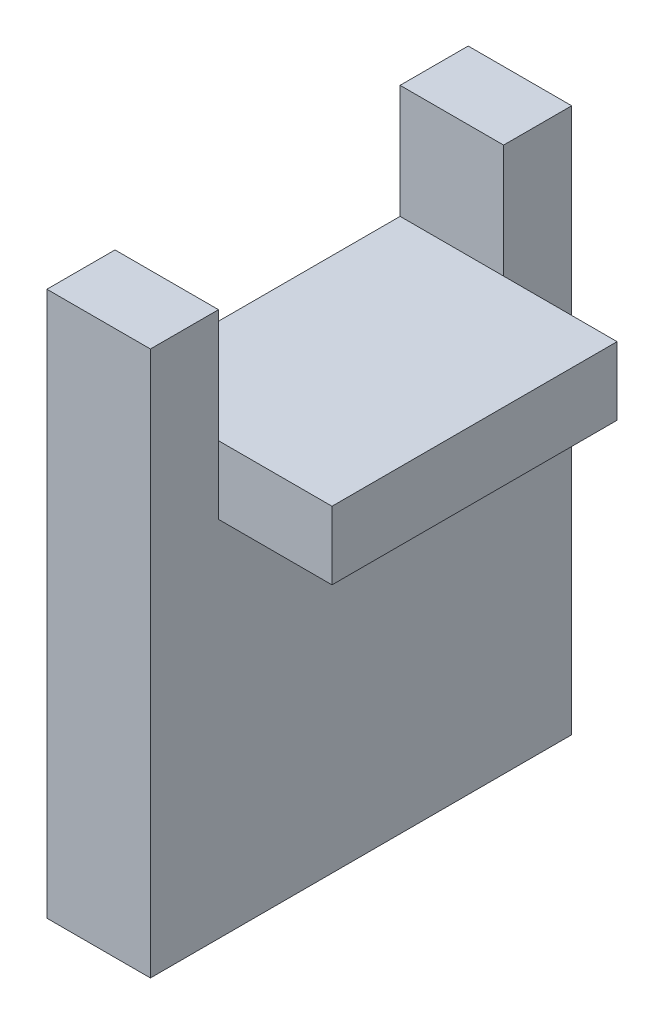
ISO-10303-21;
HEADER;
FILE_DESCRIPTION(('STEP AP214'),'2;1');
FILE_NAME('part.step','',(''),(''),'','','');
FILE_SCHEMA(('AUTOMOTIVE_DESIGN { 1 0 10303 214 1 1 1 1 }'));
ENDSEC;
DATA;
#1=APPLICATION_CONTEXT('core data for automotive mechanical design processes');
#2=APPLICATION_PROTOCOL_DEFINITION('international standard','automotive_design',2000,#1);
#3=PRODUCT_CONTEXT('',#1,'mechanical');
#4=PRODUCT('Part','Part','',(#3));
#5=PRODUCT_RELATED_PRODUCT_CATEGORY('part','',(#4));
#6=PRODUCT_DEFINITION_FORMATION('','',#4);
#7=PRODUCT_DEFINITION_CONTEXT('part definition',#1,'design');
#8=PRODUCT_DEFINITION('design','',#6,#7);
#9=PRODUCT_DEFINITION_SHAPE('','',#8);
#10=(LENGTH_UNIT() NAMED_UNIT(*) SI_UNIT(.MILLI.,.METRE.));
#11=(NAMED_UNIT(*) PLANE_ANGLE_UNIT() SI_UNIT($,.RADIAN.));
#12=(NAMED_UNIT(*) SI_UNIT($,.STERADIAN.) SOLID_ANGLE_UNIT());
#13=UNCERTAINTY_MEASURE_WITH_UNIT(LENGTH_MEASURE(1.E-05),#10,'distance_accuracy_value','');
#14=(GEOMETRIC_REPRESENTATION_CONTEXT(3) GLOBAL_UNCERTAINTY_ASSIGNED_CONTEXT((#13)) GLOBAL_UNIT_ASSIGNED_CONTEXT((#10,
#11,#12)) REPRESENTATION_CONTEXT('',''));
#15=CARTESIAN_POINT('',(0.,0.,0.));
#16=DIRECTION('',(0.,0.,1.));
#17=DIRECTION('',(1.,0.,0.));
#18=AXIS2_PLACEMENT_3D('',#15,#16,#17);
#19=CARTESIAN_POINT('',(4.56,24.,0.));
#20=DIRECTION('',(-1.,0.,0.));
#21=DIRECTION('',(0.,0.,1.));
#22=AXIS2_PLACEMENT_3D('',#19,#20,#21);
#23=PLANE('',#22);
#24=DIRECTION('',(0.,-1.,0.));
#25=VECTOR('',#24,1.);
#26=CARTESIAN_POINT('',(4.56,19.,-3.));
#27=LINE('',#26,#25);
#28=CARTESIAN_POINT('',(4.56,19.,-3.));
#29=VERTEX_POINT('',#28);
#30=CARTESIAN_POINT('',(4.56,16.,-3.));
#31=VERTEX_POINT('',#30);
#32=EDGE_CURVE('E138',#29,#31,#27,.T.);
#33=ORIENTED_EDGE('',*,*,#32,.F.);
#34=DIRECTION('',(0.,1.,0.));
#35=VECTOR('',#34,1.);
#36=CARTESIAN_POINT('',(4.56,19.,-3.));
#37=LINE('',#36,#35);
#38=CARTESIAN_POINT('',(4.56,24.,-3.));
#39=VERTEX_POINT('',#38);
#40=EDGE_CURVE('E156',#29,#39,#37,.T.);
#41=ORIENTED_EDGE('',*,*,#40,.T.);
#42=DIRECTION('',(0.,0.,-1.));
#43=VECTOR('',#42,1.);
#44=CARTESIAN_POINT('',(4.56,24.,0.));
#45=LINE('',#44,#43);
#46=CARTESIAN_POINT('',(4.56,24.,0.));
#47=VERTEX_POINT('',#46);
#48=EDGE_CURVE('E173',#47,#39,#45,.T.);
#49=ORIENTED_EDGE('',*,*,#48,.F.);
#50=DIRECTION('',(0.,-1.,0.));
#51=VECTOR('',#50,1.);
#52=CARTESIAN_POINT('',(4.56,24.,0.));
#53=LINE('',#52,#51);
#54=CARTESIAN_POINT('',(4.56,0.,0.));
#55=VERTEX_POINT('',#54);
#56=EDGE_CURVE('E41',#47,#55,#53,.T.);
#57=ORIENTED_EDGE('',*,*,#56,.T.);
#58=DIRECTION('',(0.,0.,-1.));
#59=VECTOR('',#58,1.);
#60=CARTESIAN_POINT('',(4.56,0.,0.));
#61=LINE('',#60,#59);
#62=CARTESIAN_POINT('',(4.56,0.,-18.56));
#63=VERTEX_POINT('',#62);
#64=EDGE_CURVE('E183',#55,#63,#61,.T.);
#65=ORIENTED_EDGE('',*,*,#64,.T.);
#66=DIRECTION('',(0.,-1.,0.));
#67=VECTOR('',#66,1.);
#68=CARTESIAN_POINT('',(4.56,24.,-18.56));
#69=LINE('',#68,#67);
#70=CARTESIAN_POINT('',(4.56,24.,-18.56));
#71=VERTEX_POINT('',#70);
#72=EDGE_CURVE('E189',#71,#63,#69,.T.);
#73=ORIENTED_EDGE('',*,*,#72,.F.);
#74=CARTESIAN_POINT('',(4.56,24.,-15.56));
#75=VERTEX_POINT('',#74);
#76=EDGE_CURVE('E172',#75,#71,#45,.T.);
#77=ORIENTED_EDGE('',*,*,#76,.F.);
#78=DIRECTION('',(0.,1.,0.));
#79=VECTOR('',#78,1.);
#80=CARTESIAN_POINT('',(4.56,19.,-15.56));
#81=LINE('',#80,#79);
#82=CARTESIAN_POINT('',(4.56,19.,-15.56));
#83=VERTEX_POINT('',#82);
#84=EDGE_CURVE('E56',#83,#75,#81,.T.);
#85=ORIENTED_EDGE('',*,*,#84,.F.);
#86=DIRECTION('',(0.,1.,0.));
#87=VECTOR('',#86,1.);
#88=CARTESIAN_POINT('',(4.56,19.,-15.56));
#89=LINE('',#88,#87);
#90=CARTESIAN_POINT('',(4.56,16.,-15.56));
#91=VERTEX_POINT('',#90);
#92=EDGE_CURVE('E135',#91,#83,#89,.T.);
#93=ORIENTED_EDGE('',*,*,#92,.F.);
#94=DIRECTION('',(0.,0.,-1.));
#95=VECTOR('',#94,1.);
#96=CARTESIAN_POINT('',(4.56,16.,-3.));
#97=LINE('',#96,#95);
#98=EDGE_CURVE('E48',#31,#91,#97,.T.);
#99=ORIENTED_EDGE('',*,*,#98,.F.);
#100=EDGE_LOOP('',(#33,#41,#49,#57,#65,#73,#77,#85,#93,#99));
#101=FACE_BOUND('',#100,.T.);
#102=ADVANCED_FACE('F33',(#101),#23,.F.);
#103=CARTESIAN_POINT('',(0.,24.,0.));
#104=DIRECTION('',(0.,-1.,0.));
#105=DIRECTION('',(0.,0.,-1.));
#106=AXIS2_PLACEMENT_3D('',#103,#104,#105);
#107=PLANE('',#106);
#108=ORIENTED_EDGE('',*,*,#48,.T.);
#109=DIRECTION('',(1.,0.,0.));
#110=VECTOR('',#109,1.);
#111=CARTESIAN_POINT('',(4.56,24.,-3.));
#112=LINE('',#111,#110);
#113=CARTESIAN_POINT('',(0.,24.,-3.));
#114=VERTEX_POINT('',#113);
#115=EDGE_CURVE('E141',#114,#39,#112,.T.);
#116=ORIENTED_EDGE('',*,*,#115,.F.);
#117=DIRECTION('',(0.,0.,1.));
#118=VECTOR('',#117,1.);
#119=CARTESIAN_POINT('',(0.,24.,0.));
#120=LINE('',#119,#118);
#121=CARTESIAN_POINT('',(0.,24.,0.));
#122=VERTEX_POINT('',#121);
#123=EDGE_CURVE('E170',#114,#122,#120,.T.);
#124=ORIENTED_EDGE('',*,*,#123,.T.);
#125=DIRECTION('',(1.,0.,0.));
#126=VECTOR('',#125,1.);
#127=CARTESIAN_POINT('',(0.,24.,0.));
#128=LINE('',#127,#126);
#129=EDGE_CURVE('E169',#122,#47,#128,.T.);
#130=ORIENTED_EDGE('',*,*,#129,.T.);
#131=EDGE_LOOP('',(#108,#116,#124,#130));
#132=FACE_BOUND('',#131,.T.);
#133=ADVANCED_FACE('F235',(#132),#107,.F.);
#134=CARTESIAN_POINT('',(0.,24.,0.));
#135=DIRECTION('',(1.,0.,0.));
#136=DIRECTION('',(0.,0.,-1.));
#137=AXIS2_PLACEMENT_3D('',#134,#135,#136);
#138=PLANE('',#137);
#139=ORIENTED_EDGE('',*,*,#123,.F.);
#140=DIRECTION('',(0.,1.,0.));
#141=VECTOR('',#140,1.);
#142=CARTESIAN_POINT('',(0.,19.,-3.));
#143=LINE('',#142,#141);
#144=CARTESIAN_POINT('',(0.,19.,-3.));
#145=VERTEX_POINT('',#144);
#146=EDGE_CURVE('E160',#145,#114,#143,.T.);
#147=ORIENTED_EDGE('',*,*,#146,.F.);
#148=DIRECTION('',(0.,0.,1.));
#149=VECTOR('',#148,1.);
#150=CARTESIAN_POINT('',(0.,19.,-3.));
#151=LINE('',#150,#149);
#152=CARTESIAN_POINT('',(0.,19.,-15.56));
#153=VERTEX_POINT('',#152);
#154=EDGE_CURVE('E150',#153,#145,#151,.T.);
#155=ORIENTED_EDGE('',*,*,#154,.F.);
#156=DIRECTION('',(0.,1.,0.));
#157=VECTOR('',#156,1.);
#158=CARTESIAN_POINT('',(0.,19.,-15.56));
#159=LINE('',#158,#157);
#160=CARTESIAN_POINT('',(0.,24.,-15.56));
#161=VERTEX_POINT('',#160);
#162=EDGE_CURVE('E162',#153,#161,#159,.T.);
#163=ORIENTED_EDGE('',*,*,#162,.T.);
#164=CARTESIAN_POINT('',(0.,24.,-18.56));
#165=VERTEX_POINT('',#164);
#166=EDGE_CURVE('E166',#165,#161,#120,.T.);
#167=ORIENTED_EDGE('',*,*,#166,.F.);
#168=DIRECTION('',(0.,-1.,0.));
#169=VECTOR('',#168,1.);
#170=CARTESIAN_POINT('',(0.,24.,-18.56));
#171=LINE('',#170,#169);
#172=CARTESIAN_POINT('',(0.,0.,-18.56));
#173=VERTEX_POINT('',#172);
#174=EDGE_CURVE('E178',#165,#173,#171,.T.);
#175=ORIENTED_EDGE('',*,*,#174,.T.);
#176=DIRECTION('',(0.,0.,1.));
#177=VECTOR('',#176,1.);
#178=CARTESIAN_POINT('',(0.,0.,0.));
#179=LINE('',#178,#177);
#180=CARTESIAN_POINT('',(0.,0.,0.));
#181=VERTEX_POINT('',#180);
#182=EDGE_CURVE('E159',#173,#181,#179,.T.);
#183=ORIENTED_EDGE('',*,*,#182,.T.);
#184=DIRECTION('',(0.,-1.,0.));
#185=VECTOR('',#184,1.);
#186=CARTESIAN_POINT('',(0.,24.,0.));
#187=LINE('',#186,#185);
#188=EDGE_CURVE('E11',#122,#181,#187,.T.);
#189=ORIENTED_EDGE('',*,*,#188,.F.);
#190=EDGE_LOOP('',(#139,#147,#155,#163,#167,#175,#183,#189));
#191=FACE_BOUND('',#190,.T.);
#192=ADVANCED_FACE('F35',(#191),#138,.F.);
#193=CARTESIAN_POINT('',(0.,24.,0.));
#194=DIRECTION('',(0.,0.,-1.));
#195=DIRECTION('',(-1.,0.,0.));
#196=AXIS2_PLACEMENT_3D('',#193,#194,#195);
#197=PLANE('',#196);
#198=DIRECTION('',(1.,0.,0.));
#199=VECTOR('',#198,1.);
#200=CARTESIAN_POINT('',(0.,0.,0.));
#201=LINE('',#200,#199);
#202=EDGE_CURVE('E181',#181,#55,#201,.T.);
#203=ORIENTED_EDGE('',*,*,#202,.T.);
#204=ORIENTED_EDGE('',*,*,#56,.F.);
#205=ORIENTED_EDGE('',*,*,#129,.F.);
#206=ORIENTED_EDGE('',*,*,#188,.T.);
#207=EDGE_LOOP('',(#203,#204,#205,#206));
#208=FACE_BOUND('',#207,.T.);
#209=ADVANCED_FACE('F236',(#208),#197,.F.);
#210=CARTESIAN_POINT('',(0.,24.,-18.56));
#211=DIRECTION('',(0.,0.,1.));
#212=DIRECTION('',(1.,0.,0.));
#213=AXIS2_PLACEMENT_3D('',#210,#211,#212);
#214=PLANE('',#213);
#215=DIRECTION('',(-1.,0.,0.));
#216=VECTOR('',#215,1.);
#217=CARTESIAN_POINT('',(0.,0.,-18.56));
#218=LINE('',#217,#216);
#219=EDGE_CURVE('E185',#63,#173,#218,.T.);
#220=ORIENTED_EDGE('',*,*,#219,.T.);
#221=ORIENTED_EDGE('',*,*,#174,.F.);
#222=DIRECTION('',(-1.,0.,0.));
#223=VECTOR('',#222,1.);
#224=CARTESIAN_POINT('',(0.,24.,-18.56));
#225=LINE('',#224,#223);
#226=EDGE_CURVE('E176',#71,#165,#225,.T.);
#227=ORIENTED_EDGE('',*,*,#226,.F.);
#228=ORIENTED_EDGE('',*,*,#72,.T.);
#229=EDGE_LOOP('',(#220,#221,#227,#228));
#230=FACE_BOUND('',#229,.T.);
#231=ADVANCED_FACE('F204',(#230),#214,.F.);
#232=ORIENTED_EDGE('',*,*,#166,.T.);
#233=DIRECTION('',(-1.,0.,0.));
#234=VECTOR('',#233,1.);
#235=CARTESIAN_POINT('',(4.56,24.,-15.56));
#236=LINE('',#235,#234);
#237=EDGE_CURVE('E139',#75,#161,#236,.T.);
#238=ORIENTED_EDGE('',*,*,#237,.F.);
#239=ORIENTED_EDGE('',*,*,#76,.T.);
#240=ORIENTED_EDGE('',*,*,#226,.T.);
#241=EDGE_LOOP('',(#232,#238,#239,#240));
#242=FACE_BOUND('',#241,.T.);
#243=ADVANCED_FACE('F212',(#242),#107,.F.);
#244=CARTESIAN_POINT('',(0.,0.,0.));
#245=DIRECTION('',(0.,-1.,0.));
#246=DIRECTION('',(0.,0.,-1.));
#247=AXIS2_PLACEMENT_3D('',#244,#245,#246);
#248=PLANE('',#247);
#249=ORIENTED_EDGE('',*,*,#182,.F.);
#250=ORIENTED_EDGE('',*,*,#219,.F.);
#251=ORIENTED_EDGE('',*,*,#64,.F.);
#252=ORIENTED_EDGE('',*,*,#202,.F.);
#253=EDGE_LOOP('',(#249,#250,#251,#252));
#254=FACE_BOUND('',#253,.T.);
#255=ADVANCED_FACE('F201',(#254),#248,.T.);
#256=CARTESIAN_POINT('',(4.56,19.,-3.));
#257=DIRECTION('',(0.,0.,1.));
#258=DIRECTION('',(1.,0.,0.));
#259=AXIS2_PLACEMENT_3D('',#256,#257,#258);
#260=PLANE('',#259);
#261=ORIENTED_EDGE('',*,*,#115,.T.);
#262=ORIENTED_EDGE('',*,*,#40,.F.);
#263=DIRECTION('',(1.,0.,0.));
#264=VECTOR('',#263,1.);
#265=CARTESIAN_POINT('',(4.56,19.,-3.));
#266=LINE('',#265,#264);
#267=EDGE_CURVE('E152',#145,#29,#266,.T.);
#268=ORIENTED_EDGE('',*,*,#267,.F.);
#269=ORIENTED_EDGE('',*,*,#146,.T.);
#270=EDGE_LOOP('',(#261,#262,#268,#269));
#271=FACE_BOUND('',#270,.T.);
#272=ADVANCED_FACE('F232',(#271),#260,.F.);
#273=CARTESIAN_POINT('',(4.56,19.,-15.56));
#274=DIRECTION('',(0.,0.,-1.));
#275=DIRECTION('',(-1.,0.,0.));
#276=AXIS2_PLACEMENT_3D('',#273,#274,#275);
#277=PLANE('',#276);
#278=ORIENTED_EDGE('',*,*,#237,.T.);
#279=ORIENTED_EDGE('',*,*,#162,.F.);
#280=DIRECTION('',(-1.,0.,0.));
#281=VECTOR('',#280,1.);
#282=CARTESIAN_POINT('',(4.56,19.,-15.56));
#283=LINE('',#282,#281);
#284=EDGE_CURVE('E147',#83,#153,#283,.T.);
#285=ORIENTED_EDGE('',*,*,#284,.F.);
#286=ORIENTED_EDGE('',*,*,#84,.T.);
#287=EDGE_LOOP('',(#278,#279,#285,#286));
#288=FACE_BOUND('',#287,.T.);
#289=ADVANCED_FACE('F253',(#288),#277,.F.);
#290=CARTESIAN_POINT('',(0.,19.,0.));
#291=DIRECTION('',(0.,1.,0.));
#292=DIRECTION('',(0.,0.,1.));
#293=AXIS2_PLACEMENT_3D('',#290,#291,#292);
#294=PLANE('',#293);
#295=ORIENTED_EDGE('',*,*,#267,.T.);
#296=DIRECTION('',(-1.,0.,0.));
#297=VECTOR('',#296,1.);
#298=CARTESIAN_POINT('',(9.56,19.,-3.));
#299=LINE('',#298,#297);
#300=CARTESIAN_POINT('',(9.56,19.,-3.));
#301=VERTEX_POINT('',#300);
#302=EDGE_CURVE('E222',#301,#29,#299,.T.);
#303=ORIENTED_EDGE('',*,*,#302,.F.);
#304=DIRECTION('',(0.,0.,1.));
#305=VECTOR('',#304,1.);
#306=CARTESIAN_POINT('',(9.56,19.,-3.));
#307=LINE('',#306,#305);
#308=CARTESIAN_POINT('',(9.56,19.,-15.56));
#309=VERTEX_POINT('',#308);
#310=EDGE_CURVE('E131',#309,#301,#307,.T.);
#311=ORIENTED_EDGE('',*,*,#310,.F.);
#312=DIRECTION('',(-1.,0.,0.));
#313=VECTOR('',#312,1.);
#314=CARTESIAN_POINT('',(9.56,19.,-15.56));
#315=LINE('',#314,#313);
#316=EDGE_CURVE('E143',#309,#83,#315,.T.);
#317=ORIENTED_EDGE('',*,*,#316,.T.);
#318=ORIENTED_EDGE('',*,*,#284,.T.);
#319=ORIENTED_EDGE('',*,*,#154,.T.);
#320=EDGE_LOOP('',(#295,#303,#311,#317,#318,#319));
#321=FACE_BOUND('',#320,.T.);
#322=ADVANCED_FACE('F221',(#321),#294,.T.);
#323=CARTESIAN_POINT('',(9.56,19.,-3.));
#324=DIRECTION('',(0.,0.,-1.));
#325=DIRECTION('',(0.,1.,0.));
#326=AXIS2_PLACEMENT_3D('',#323,#324,#325);
#327=PLANE('',#326);
#328=ORIENTED_EDGE('',*,*,#32,.T.);
#329=DIRECTION('',(-1.,0.,0.));
#330=VECTOR('',#329,1.);
#331=CARTESIAN_POINT('',(9.56,16.,-3.));
#332=LINE('',#331,#330);
#333=CARTESIAN_POINT('',(9.56,16.,-3.));
#334=VERTEX_POINT('',#333);
#335=EDGE_CURVE('E119',#334,#31,#332,.T.);
#336=ORIENTED_EDGE('',*,*,#335,.F.);
#337=DIRECTION('',(0.,-1.,0.));
#338=VECTOR('',#337,1.);
#339=CARTESIAN_POINT('',(9.56,19.,-3.));
#340=LINE('',#339,#338);
#341=EDGE_CURVE('E126',#301,#334,#340,.T.);
#342=ORIENTED_EDGE('',*,*,#341,.F.);
#343=ORIENTED_EDGE('',*,*,#302,.T.);
#344=EDGE_LOOP('',(#328,#336,#342,#343));
#345=FACE_BOUND('',#344,.T.);
#346=ADVANCED_FACE('F137',(#345),#327,.F.);
#347=CARTESIAN_POINT('',(9.56,16.,-3.));
#348=DIRECTION('',(0.,1.,0.));
#349=DIRECTION('',(0.,0.,1.));
#350=AXIS2_PLACEMENT_3D('',#347,#348,#349);
#351=PLANE('',#350);
#352=ORIENTED_EDGE('',*,*,#98,.T.);
#353=DIRECTION('',(-1.,0.,0.));
#354=VECTOR('',#353,1.);
#355=CARTESIAN_POINT('',(9.56,16.,-15.56));
#356=LINE('',#355,#354);
#357=CARTESIAN_POINT('',(9.56,16.,-15.56));
#358=VERTEX_POINT('',#357);
#359=EDGE_CURVE('E122',#358,#91,#356,.T.);
#360=ORIENTED_EDGE('',*,*,#359,.F.);
#361=DIRECTION('',(0.,0.,-1.));
#362=VECTOR('',#361,1.);
#363=CARTESIAN_POINT('',(9.56,16.,-3.));
#364=LINE('',#363,#362);
#365=EDGE_CURVE('E115',#334,#358,#364,.T.);
#366=ORIENTED_EDGE('',*,*,#365,.F.);
#367=ORIENTED_EDGE('',*,*,#335,.T.);
#368=EDGE_LOOP('',(#352,#360,#366,#367));
#369=FACE_BOUND('',#368,.T.);
#370=ADVANCED_FACE('F117',(#369),#351,.F.);
#371=CARTESIAN_POINT('',(9.56,19.,-15.56));
#372=DIRECTION('',(0.,0.,1.));
#373=DIRECTION('',(1.,0.,0.));
#374=AXIS2_PLACEMENT_3D('',#371,#372,#373);
#375=PLANE('',#374);
#376=ORIENTED_EDGE('',*,*,#92,.T.);
#377=ORIENTED_EDGE('',*,*,#316,.F.);
#378=DIRECTION('',(0.,1.,0.));
#379=VECTOR('',#378,1.);
#380=CARTESIAN_POINT('',(9.56,19.,-15.56));
#381=LINE('',#380,#379);
#382=EDGE_CURVE('E125',#358,#309,#381,.T.);
#383=ORIENTED_EDGE('',*,*,#382,.F.);
#384=ORIENTED_EDGE('',*,*,#359,.T.);
#385=EDGE_LOOP('',(#376,#377,#383,#384));
#386=FACE_BOUND('',#385,.T.);
#387=ADVANCED_FACE('F218',(#386),#375,.F.);
#388=CARTESIAN_POINT('',(9.56,0.,0.));
#389=DIRECTION('',(1.,0.,0.));
#390=DIRECTION('',(0.,0.,-1.));
#391=AXIS2_PLACEMENT_3D('',#388,#389,#390);
#392=PLANE('',#391);
#393=ORIENTED_EDGE('',*,*,#341,.T.);
#394=ORIENTED_EDGE('',*,*,#365,.T.);
#395=ORIENTED_EDGE('',*,*,#382,.T.);
#396=ORIENTED_EDGE('',*,*,#310,.T.);
#397=EDGE_LOOP('',(#393,#394,#395,#396));
#398=FACE_BOUND('',#397,.T.);
#399=ADVANCED_FACE('F129',(#398),#392,.T.);
#400=CLOSED_SHELL('',(#102,#133,#192,#209,#231,#243,#255,#272,#289,#322,#346,#370,#387,#399));
#401=MANIFOLD_SOLID_BREP('B2',#400);
#402=ADVANCED_BREP_SHAPE_REPRESENTATION('',(#18,#401),#14);
#403=SHAPE_DEFINITION_REPRESENTATION(#9,#402);
ENDSEC;
END-ISO-10303-21;
